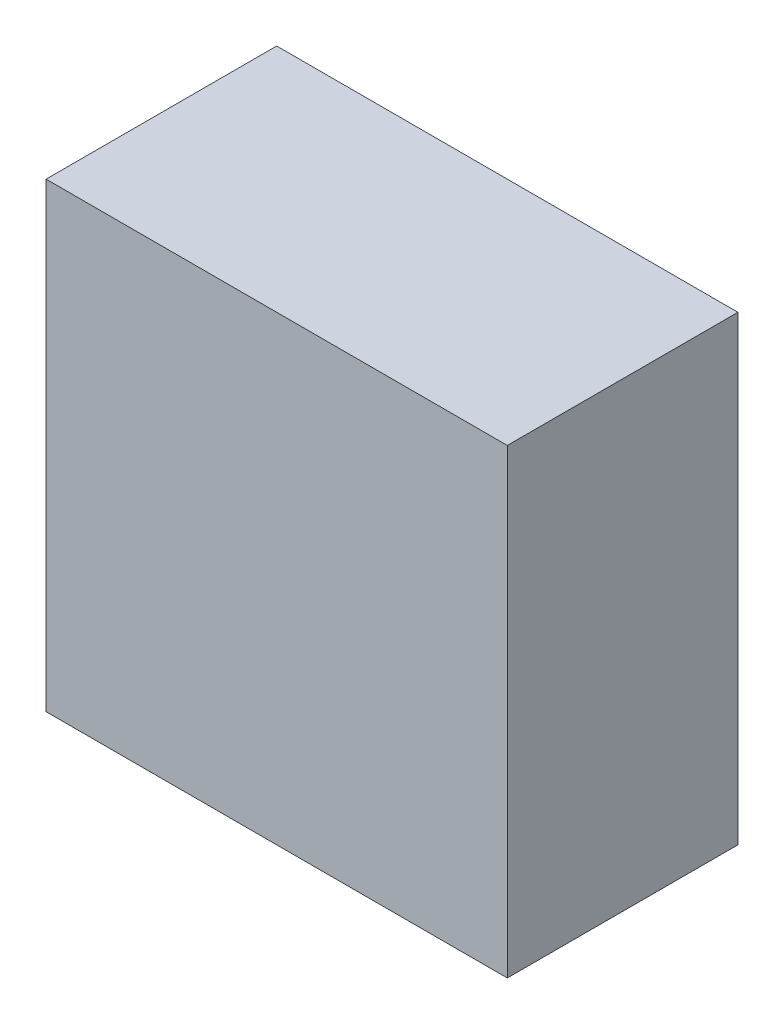
ISO-10303-21;
HEADER;
FILE_DESCRIPTION(('STEP AP214'),'2;1');
FILE_NAME('part.step','',(''),(''),'','','');
FILE_SCHEMA(('AUTOMOTIVE_DESIGN { 1 0 10303 214 1 1 1 1 }'));
ENDSEC;
DATA;
#1=APPLICATION_CONTEXT('core data for automotive mechanical design processes');
#2=APPLICATION_PROTOCOL_DEFINITION('international standard','automotive_design',2000,#1);
#3=PRODUCT_CONTEXT('',#1,'mechanical');
#4=PRODUCT('Part','Part','',(#3));
#5=PRODUCT_RELATED_PRODUCT_CATEGORY('part','',(#4));
#6=PRODUCT_DEFINITION_FORMATION('','',#4);
#7=PRODUCT_DEFINITION_CONTEXT('part definition',#1,'design');
#8=PRODUCT_DEFINITION('design','',#6,#7);
#9=PRODUCT_DEFINITION_SHAPE('','',#8);
#10=(LENGTH_UNIT() NAMED_UNIT(*) SI_UNIT(.MILLI.,.METRE.));
#11=(NAMED_UNIT(*) PLANE_ANGLE_UNIT() SI_UNIT($,.RADIAN.));
#12=(NAMED_UNIT(*) SI_UNIT($,.STERADIAN.) SOLID_ANGLE_UNIT());
#13=UNCERTAINTY_MEASURE_WITH_UNIT(LENGTH_MEASURE(1.E-05),#10,'distance_accuracy_value','');
#14=(GEOMETRIC_REPRESENTATION_CONTEXT(3) GLOBAL_UNCERTAINTY_ASSIGNED_CONTEXT((#13)) GLOBAL_UNIT_ASSIGNED_CONTEXT((#10,
#11,#12)) REPRESENTATION_CONTEXT('',''));
#15=CARTESIAN_POINT('',(0.,0.,0.));
#16=DIRECTION('',(0.,0.,1.));
#17=DIRECTION('',(1.,0.,0.));
#18=AXIS2_PLACEMENT_3D('',#15,#16,#17);
#19=CARTESIAN_POINT('',(0.,0.,-10.));
#20=DIRECTION('',(-1.,0.,0.));
#21=DIRECTION('',(0.,0.,1.));
#22=AXIS2_PLACEMENT_3D('',#19,#20,#21);
#23=PLANE('',#22);
#24=DIRECTION('',(0.,-1.,0.));
#25=VECTOR('',#24,1.);
#26=CARTESIAN_POINT('',(0.,0.,-5.));
#27=LINE('',#26,#25);
#28=CARTESIAN_POINT('',(0.,10.,-5.));
#29=VERTEX_POINT('',#28);
#30=CARTESIAN_POINT('',(0.,0.,-5.));
#31=VERTEX_POINT('',#30);
#32=EDGE_CURVE('E102',#29,#31,#27,.T.);
#33=ORIENTED_EDGE('',*,*,#32,.F.);
#34=DIRECTION('',(0.,0.,1.));
#35=VECTOR('',#34,1.);
#36=CARTESIAN_POINT('',(0.,10.,-5.));
#37=LINE('',#36,#35);
#38=CARTESIAN_POINT('',(0.,10.,0.));
#39=VERTEX_POINT('',#38);
#40=EDGE_CURVE('E232',#29,#39,#37,.T.);
#41=ORIENTED_EDGE('',*,*,#40,.T.);
#42=DIRECTION('',(0.,-1.,0.));
#43=VECTOR('',#42,1.);
#44=CARTESIAN_POINT('',(0.,0.,0.));
#45=LINE('',#44,#43);
#46=CARTESIAN_POINT('',(0.,0.,0.));
#47=VERTEX_POINT('',#46);
#48=EDGE_CURVE('E228',#39,#47,#45,.T.);
#49=ORIENTED_EDGE('',*,*,#48,.T.);
#50=DIRECTION('',(0.,0.,1.));
#51=VECTOR('',#50,1.);
#52=CARTESIAN_POINT('',(0.,0.,-10.));
#53=LINE('',#52,#51);
#54=CARTESIAN_POINT('',(0.,0.,10.));
#55=VERTEX_POINT('',#54);
#56=EDGE_CURVE('E124',#47,#55,#53,.T.);
#57=ORIENTED_EDGE('',*,*,#56,.T.);
#58=DIRECTION('',(0.,-1.,0.));
#59=VECTOR('',#58,1.);
#60=CARTESIAN_POINT('',(0.,0.,10.));
#61=LINE('',#60,#59);
#62=CARTESIAN_POINT('',(0.,40.,10.));
#63=VERTEX_POINT('',#62);
#64=EDGE_CURVE('E235',#63,#55,#61,.T.);
#65=ORIENTED_EDGE('',*,*,#64,.F.);
#66=DIRECTION('',(0.,0.,1.));
#67=VECTOR('',#66,1.);
#68=CARTESIAN_POINT('',(0.,40.,-10.));
#69=LINE('',#68,#67);
#70=CARTESIAN_POINT('',(0.,40.,-10.));
#71=VERTEX_POINT('',#70);
#72=EDGE_CURVE('E11',#71,#63,#69,.T.);
#73=ORIENTED_EDGE('',*,*,#72,.F.);
#74=DIRECTION('',(0.,-1.,0.));
#75=VECTOR('',#74,1.);
#76=CARTESIAN_POINT('',(0.,0.,-10.));
#77=LINE('',#76,#75);
#78=CARTESIAN_POINT('',(0.,0.,-10.));
#79=VERTEX_POINT('',#78);
#80=EDGE_CURVE('E122',#71,#79,#77,.T.);
#81=ORIENTED_EDGE('',*,*,#80,.T.);
#82=EDGE_CURVE('E38',#79,#31,#53,.T.);
#83=ORIENTED_EDGE('',*,*,#82,.T.);
#84=EDGE_LOOP('',(#33,#41,#49,#57,#65,#73,#81,#83));
#85=FACE_BOUND('',#84,.T.);
#86=ADVANCED_FACE('F35',(#85),#23,.T.);
#87=CARTESIAN_POINT('',(0.,40.,-10.));
#88=DIRECTION('',(0.,1.,0.));
#89=DIRECTION('',(0.,0.,1.));
#90=AXIS2_PLACEMENT_3D('',#87,#88,#89);
#91=PLANE('',#90);
#92=ORIENTED_EDGE('',*,*,#72,.T.);
#93=DIRECTION('',(-1.,0.,0.));
#94=VECTOR('',#93,1.);
#95=CARTESIAN_POINT('',(0.,40.,10.));
#96=LINE('',#95,#94);
#97=CARTESIAN_POINT('',(40.,40.,10.));
#98=VERTEX_POINT('',#97);
#99=EDGE_CURVE('E151',#98,#63,#96,.T.);
#100=ORIENTED_EDGE('',*,*,#99,.F.);
#101=DIRECTION('',(0.,0.,1.));
#102=VECTOR('',#101,1.);
#103=CARTESIAN_POINT('',(40.,40.,-10.));
#104=LINE('',#103,#102);
#105=CARTESIAN_POINT('',(40.,40.,-10.));
#106=VERTEX_POINT('',#105);
#107=EDGE_CURVE('E43',#106,#98,#104,.T.);
#108=ORIENTED_EDGE('',*,*,#107,.F.);
#109=DIRECTION('',(-1.,0.,0.));
#110=VECTOR('',#109,1.);
#111=CARTESIAN_POINT('',(0.,40.,-10.));
#112=LINE('',#111,#110);
#113=EDGE_CURVE('E125',#106,#71,#112,.T.);
#114=ORIENTED_EDGE('',*,*,#113,.T.);
#115=EDGE_LOOP('',(#92,#100,#108,#114));
#116=FACE_BOUND('',#115,.T.);
#117=ADVANCED_FACE('F154',(#116),#91,.T.);
#118=CARTESIAN_POINT('',(40.,0.,-10.));
#119=DIRECTION('',(1.,0.,0.));
#120=DIRECTION('',(0.,0.,-1.));
#121=AXIS2_PLACEMENT_3D('',#118,#119,#120);
#122=PLANE('',#121);
#123=ORIENTED_EDGE('',*,*,#107,.T.);
#124=DIRECTION('',(0.,1.,0.));
#125=VECTOR('',#124,1.);
#126=CARTESIAN_POINT('',(40.,0.,10.));
#127=LINE('',#126,#125);
#128=CARTESIAN_POINT('',(40.,0.,10.));
#129=VERTEX_POINT('',#128);
#130=EDGE_CURVE('E143',#129,#98,#127,.T.);
#131=ORIENTED_EDGE('',*,*,#130,.F.);
#132=DIRECTION('',(0.,0.,1.));
#133=VECTOR('',#132,1.);
#134=CARTESIAN_POINT('',(40.,0.,-10.));
#135=LINE('',#134,#133);
#136=CARTESIAN_POINT('',(40.,0.,-10.));
#137=VERTEX_POINT('',#136);
#138=EDGE_CURVE('E123',#137,#129,#135,.T.);
#139=ORIENTED_EDGE('',*,*,#138,.F.);
#140=DIRECTION('',(0.,1.,0.));
#141=VECTOR('',#140,1.);
#142=CARTESIAN_POINT('',(40.,0.,-10.));
#143=LINE('',#142,#141);
#144=EDGE_CURVE('E130',#137,#106,#143,.T.);
#145=ORIENTED_EDGE('',*,*,#144,.T.);
#146=EDGE_LOOP('',(#123,#131,#139,#145));
#147=FACE_BOUND('',#146,.T.);
#148=ADVANCED_FACE('F142',(#147),#122,.T.);
#149=CARTESIAN_POINT('',(0.,0.,-10.));
#150=DIRECTION('',(0.,-1.,0.));
#151=DIRECTION('',(0.,0.,-1.));
#152=AXIS2_PLACEMENT_3D('',#149,#150,#151);
#153=PLANE('',#152);
#154=DIRECTION('',(1.,0.,0.));
#155=VECTOR('',#154,1.);
#156=CARTESIAN_POINT('',(0.,0.,-5.));
#157=LINE('',#156,#155);
#158=CARTESIAN_POINT('',(10.,0.,-5.));
#159=VERTEX_POINT('',#158);
#160=EDGE_CURVE('E106',#31,#159,#157,.T.);
#161=ORIENTED_EDGE('',*,*,#160,.F.);
#162=ORIENTED_EDGE('',*,*,#82,.F.);
#163=DIRECTION('',(1.,0.,0.));
#164=VECTOR('',#163,1.);
#165=CARTESIAN_POINT('',(0.,0.,-10.));
#166=LINE('',#165,#164);
#167=EDGE_CURVE('E135',#79,#137,#166,.T.);
#168=ORIENTED_EDGE('',*,*,#167,.T.);
#169=ORIENTED_EDGE('',*,*,#138,.T.);
#170=DIRECTION('',(1.,0.,0.));
#171=VECTOR('',#170,1.);
#172=CARTESIAN_POINT('',(0.,0.,10.));
#173=LINE('',#172,#171);
#174=EDGE_CURVE('E152',#55,#129,#173,.T.);
#175=ORIENTED_EDGE('',*,*,#174,.F.);
#176=ORIENTED_EDGE('',*,*,#56,.F.);
#177=DIRECTION('',(1.,0.,0.));
#178=VECTOR('',#177,1.);
#179=CARTESIAN_POINT('',(0.,0.,0.));
#180=LINE('',#179,#178);
#181=CARTESIAN_POINT('',(10.,0.,0.));
#182=VERTEX_POINT('',#181);
#183=EDGE_CURVE('E230',#47,#182,#180,.T.);
#184=ORIENTED_EDGE('',*,*,#183,.T.);
#185=DIRECTION('',(0.,0.,1.));
#186=VECTOR('',#185,1.);
#187=CARTESIAN_POINT('',(10.,0.,-5.));
#188=LINE('',#187,#186);
#189=EDGE_CURVE('E119',#159,#182,#188,.T.);
#190=ORIENTED_EDGE('',*,*,#189,.F.);
#191=EDGE_LOOP('',(#161,#162,#168,#169,#175,#176,#184,#190));
#192=FACE_BOUND('',#191,.T.);
#193=ADVANCED_FACE('F115',(#192),#153,.T.);
#194=CARTESIAN_POINT('',(0.,0.,-10.));
#195=DIRECTION('',(0.,0.,-1.));
#196=DIRECTION('',(-1.,0.,0.));
#197=AXIS2_PLACEMENT_3D('',#194,#195,#196);
#198=PLANE('',#197);
#199=ORIENTED_EDGE('',*,*,#80,.F.);
#200=ORIENTED_EDGE('',*,*,#113,.F.);
#201=ORIENTED_EDGE('',*,*,#144,.F.);
#202=ORIENTED_EDGE('',*,*,#167,.F.);
#203=EDGE_LOOP('',(#199,#200,#201,#202));
#204=FACE_BOUND('',#203,.T.);
#205=ADVANCED_FACE('F159',(#204),#198,.T.);
#206=CARTESIAN_POINT('',(0.,0.,10.));
#207=DIRECTION('',(0.,0.,-1.));
#208=DIRECTION('',(-1.,0.,0.));
#209=AXIS2_PLACEMENT_3D('',#206,#207,#208);
#210=PLANE('',#209);
#211=ORIENTED_EDGE('',*,*,#64,.T.);
#212=ORIENTED_EDGE('',*,*,#174,.T.);
#213=ORIENTED_EDGE('',*,*,#130,.T.);
#214=ORIENTED_EDGE('',*,*,#99,.T.);
#215=EDGE_LOOP('',(#211,#212,#213,#214));
#216=FACE_BOUND('',#215,.T.);
#217=ADVANCED_FACE('F150',(#216),#210,.F.);
#218=CARTESIAN_POINT('',(0.,10.,-5.));
#219=DIRECTION('',(0.,1.,0.));
#220=DIRECTION('',(0.,0.,1.));
#221=AXIS2_PLACEMENT_3D('',#218,#219,#220);
#222=PLANE('',#221);
#223=DIRECTION('',(-1.,0.,0.));
#224=VECTOR('',#223,1.);
#225=CARTESIAN_POINT('',(0.,10.,0.));
#226=LINE('',#225,#224);
#227=CARTESIAN_POINT('',(10.,10.,0.));
#228=VERTEX_POINT('',#227);
#229=EDGE_CURVE('E112',#228,#39,#226,.T.);
#230=ORIENTED_EDGE('',*,*,#229,.T.);
#231=ORIENTED_EDGE('',*,*,#40,.F.);
#232=DIRECTION('',(-1.,0.,0.));
#233=VECTOR('',#232,1.);
#234=CARTESIAN_POINT('',(0.,10.,-5.));
#235=LINE('',#234,#233);
#236=CARTESIAN_POINT('',(10.,10.,-5.));
#237=VERTEX_POINT('',#236);
#238=EDGE_CURVE('E109',#237,#29,#235,.T.);
#239=ORIENTED_EDGE('',*,*,#238,.F.);
#240=DIRECTION('',(0.,0.,1.));
#241=VECTOR('',#240,1.);
#242=CARTESIAN_POINT('',(10.,10.,-5.));
#243=LINE('',#242,#241);
#244=EDGE_CURVE('E233',#237,#228,#243,.T.);
#245=ORIENTED_EDGE('',*,*,#244,.T.);
#246=EDGE_LOOP('',(#230,#231,#239,#245));
#247=FACE_BOUND('',#246,.T.);
#248=ADVANCED_FACE('F166',(#247),#222,.F.);
#249=CARTESIAN_POINT('',(10.,0.,-5.));
#250=DIRECTION('',(1.,0.,0.));
#251=DIRECTION('',(0.,0.,-1.));
#252=AXIS2_PLACEMENT_3D('',#249,#250,#251);
#253=PLANE('',#252);
#254=DIRECTION('',(0.,1.,0.));
#255=VECTOR('',#254,1.);
#256=CARTESIAN_POINT('',(10.,0.,0.));
#257=LINE('',#256,#255);
#258=EDGE_CURVE('E51',#182,#228,#257,.T.);
#259=ORIENTED_EDGE('',*,*,#258,.T.);
#260=ORIENTED_EDGE('',*,*,#244,.F.);
#261=DIRECTION('',(0.,1.,0.));
#262=VECTOR('',#261,1.);
#263=CARTESIAN_POINT('',(10.,0.,-5.));
#264=LINE('',#263,#262);
#265=EDGE_CURVE('E120',#159,#237,#264,.T.);
#266=ORIENTED_EDGE('',*,*,#265,.F.);
#267=ORIENTED_EDGE('',*,*,#189,.T.);
#268=EDGE_LOOP('',(#259,#260,#266,#267));
#269=FACE_BOUND('',#268,.T.);
#270=ADVANCED_FACE('F196',(#269),#253,.F.);
#271=CARTESIAN_POINT('',(0.,0.,-5.));
#272=DIRECTION('',(0.,0.,-1.));
#273=DIRECTION('',(-1.,0.,0.));
#274=AXIS2_PLACEMENT_3D('',#271,#272,#273);
#275=PLANE('',#274);
#276=ORIENTED_EDGE('',*,*,#32,.T.);
#277=ORIENTED_EDGE('',*,*,#160,.T.);
#278=ORIENTED_EDGE('',*,*,#265,.T.);
#279=ORIENTED_EDGE('',*,*,#238,.T.);
#280=EDGE_LOOP('',(#276,#277,#278,#279));
#281=FACE_BOUND('',#280,.T.);
#282=ADVANCED_FACE('F104',(#281),#275,.F.);
#283=CARTESIAN_POINT('',(0.,0.,0.));
#284=DIRECTION('',(0.,0.,-1.));
#285=DIRECTION('',(-1.,0.,0.));
#286=AXIS2_PLACEMENT_3D('',#283,#284,#285);
#287=PLANE('',#286);
#288=ORIENTED_EDGE('',*,*,#48,.F.);
#289=ORIENTED_EDGE('',*,*,#229,.F.);
#290=ORIENTED_EDGE('',*,*,#258,.F.);
#291=ORIENTED_EDGE('',*,*,#183,.F.);
#292=EDGE_LOOP('',(#288,#289,#290,#291));
#293=FACE_BOUND('',#292,.T.);
#294=ADVANCED_FACE('F216',(#293),#287,.T.);
#295=CLOSED_SHELL('',(#86,#117,#148,#193,#205,#217,#248,#270,#282,#294));
#296=MANIFOLD_SOLID_BREP('B2',#295);
#297=ADVANCED_BREP_SHAPE_REPRESENTATION('',(#18,#296),#14);
#298=SHAPE_DEFINITION_REPRESENTATION(#9,#297);
ENDSEC;
END-ISO-10303-21;
